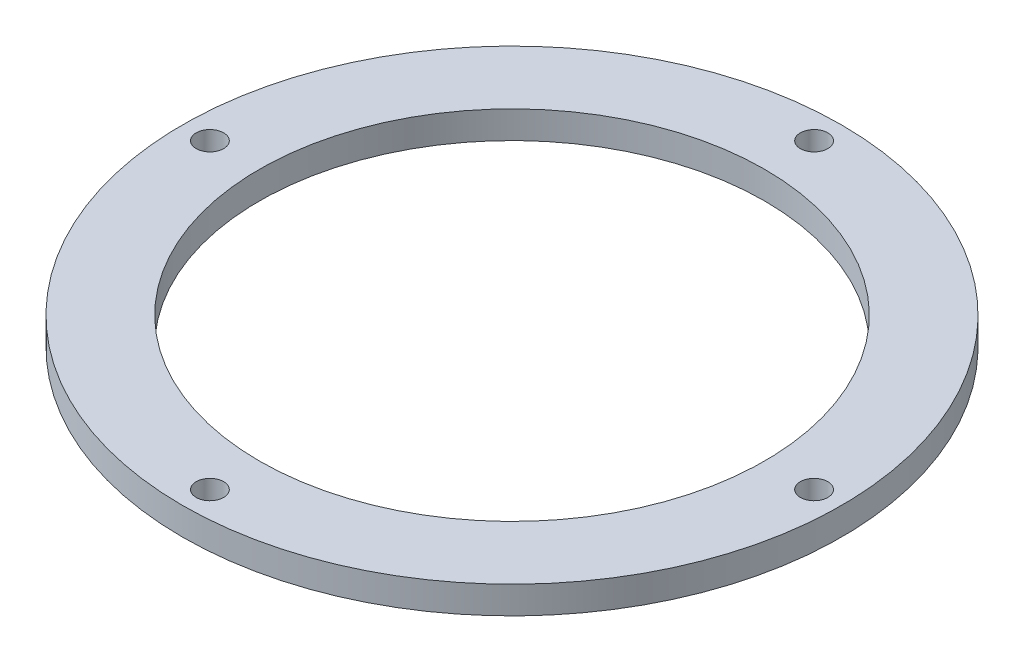
ISO-10303-21;
HEADER;
FILE_DESCRIPTION(('STEP AP214'),'2;1');
FILE_NAME('part.step','',(''),(''),'','','');
FILE_SCHEMA(('AUTOMOTIVE_DESIGN { 1 0 10303 214 1 1 1 1 }'));
ENDSEC;
DATA;
#1=APPLICATION_CONTEXT('core data for automotive mechanical design processes');
#2=APPLICATION_PROTOCOL_DEFINITION('international standard','automotive_design',2000,#1);
#3=PRODUCT_CONTEXT('',#1,'mechanical');
#4=PRODUCT('Part','Part','',(#3));
#5=PRODUCT_RELATED_PRODUCT_CATEGORY('part','',(#4));
#6=PRODUCT_DEFINITION_FORMATION('','',#4);
#7=PRODUCT_DEFINITION_CONTEXT('part definition',#1,'design');
#8=PRODUCT_DEFINITION('design','',#6,#7);
#9=PRODUCT_DEFINITION_SHAPE('','',#8);
#10=(LENGTH_UNIT() NAMED_UNIT(*) SI_UNIT(.MILLI.,.METRE.));
#11=(NAMED_UNIT(*) PLANE_ANGLE_UNIT() SI_UNIT($,.RADIAN.));
#12=(NAMED_UNIT(*) SI_UNIT($,.STERADIAN.) SOLID_ANGLE_UNIT());
#13=UNCERTAINTY_MEASURE_WITH_UNIT(LENGTH_MEASURE(1.E-05),#10,'distance_accuracy_value','');
#14=(GEOMETRIC_REPRESENTATION_CONTEXT(3) GLOBAL_UNCERTAINTY_ASSIGNED_CONTEXT((#13)) GLOBAL_UNIT_ASSIGNED_CONTEXT((#10,
#11,#12)) REPRESENTATION_CONTEXT('',''));
#15=CARTESIAN_POINT('',(0.,0.,0.));
#16=DIRECTION('',(0.,0.,1.));
#17=DIRECTION('',(1.,0.,0.));
#18=AXIS2_PLACEMENT_3D('',#15,#16,#17);
#19=CARTESIAN_POINT('',(0.,5.,0.));
#20=DIRECTION('',(0.,1.,0.));
#21=DIRECTION('',(0.,0.,1.));
#22=AXIS2_PLACEMENT_3D('',#19,#20,#21);
#23=PLANE('',#22);
#24=CARTESIAN_POINT('',(0.,5.,-55.));
#25=DIRECTION('',(0.,1.,0.));
#26=DIRECTION('',(0.,0.,1.));
#27=AXIS2_PLACEMENT_3D('',#24,#25,#26);
#28=CIRCLE('',#27,2.5);
#29=CARTESIAN_POINT('',(0.,5.,-52.5));
#30=VERTEX_POINT('',#29);
#31=EDGE_CURVE('E67',#30,#30,#28,.T.);
#32=ORIENTED_EDGE('',*,*,#31,.F.);
#33=EDGE_LOOP('',(#32));
#34=FACE_BOUND('',#33,.T.);
#35=CARTESIAN_POINT('',(55.0000000000016,5.,-1.55431223447522E-12));
#36=DIRECTION('',(0.,1.,0.));
#37=DIRECTION('',(0.,0.,1.));
#38=AXIS2_PLACEMENT_3D('',#35,#36,#37);
#39=CIRCLE('',#38,2.5);
#40=CARTESIAN_POINT('',(55.0000000000016,5.,2.49999999999845));
#41=VERTEX_POINT('',#40);
#42=EDGE_CURVE('E61',#41,#41,#39,.T.);
#43=ORIENTED_EDGE('',*,*,#42,.F.);
#44=EDGE_LOOP('',(#43));
#45=FACE_BOUND('',#44,.T.);
#46=CARTESIAN_POINT('',(3.11296127764038E-12,5.,55.));
#47=DIRECTION('',(0.,1.,0.));
#48=DIRECTION('',(0.,0.,1.));
#49=AXIS2_PLACEMENT_3D('',#46,#47,#48);
#50=CIRCLE('',#49,2.5);
#51=CARTESIAN_POINT('',(3.11296127764038E-12,5.,57.5));
#52=VERTEX_POINT('',#51);
#53=EDGE_CURVE('E55',#52,#52,#50,.T.);
#54=ORIENTED_EDGE('',*,*,#53,.F.);
#55=EDGE_LOOP('',(#54));
#56=FACE_BOUND('',#55,.T.);
#57=CARTESIAN_POINT('',(-54.9999999999984,5.,1.54737334057131E-12));
#58=DIRECTION('',(0.,1.,0.));
#59=DIRECTION('',(0.,0.,1.));
#60=AXIS2_PLACEMENT_3D('',#57,#58,#59);
#61=CIRCLE('',#60,2.5);
#62=CARTESIAN_POINT('',(-54.9999999999984,5.,2.50000000000155));
#63=VERTEX_POINT('',#62);
#64=EDGE_CURVE('E49',#63,#63,#61,.T.);
#65=ORIENTED_EDGE('',*,*,#64,.F.);
#66=EDGE_LOOP('',(#65));
#67=FACE_BOUND('',#66,.T.);
#68=CARTESIAN_POINT('',(0.,5.,0.));
#69=DIRECTION('',(0.,1.,0.));
#70=DIRECTION('',(0.,0.,1.));
#71=AXIS2_PLACEMENT_3D('',#68,#69,#70);
#72=CIRCLE('',#71,60.);
#73=CARTESIAN_POINT('',(0.,5.,60.));
#74=VERTEX_POINT('',#73);
#75=EDGE_CURVE('E10',#74,#74,#72,.T.);
#76=ORIENTED_EDGE('',*,*,#75,.T.);
#77=EDGE_LOOP('',(#76));
#78=FACE_BOUND('',#77,.T.);
#79=CARTESIAN_POINT('',(0.,5.,0.));
#80=DIRECTION('',(0.,1.,0.));
#81=DIRECTION('',(0.,0.,1.));
#82=AXIS2_PLACEMENT_3D('',#79,#80,#81);
#83=CIRCLE('',#82,46.);
#84=CARTESIAN_POINT('',(0.,5.,46.));
#85=VERTEX_POINT('',#84);
#86=EDGE_CURVE('E41',#85,#85,#83,.T.);
#87=ORIENTED_EDGE('',*,*,#86,.F.);
#88=EDGE_LOOP('',(#87));
#89=FACE_BOUND('',#88,.T.);
#90=ADVANCED_FACE('F30',(#34,#45,#56,#67,#78,#89),#23,.T.);
#91=CARTESIAN_POINT('',(0.,0.,0.));
#92=DIRECTION('',(0.,1.,0.));
#93=DIRECTION('',(0.,0.,1.));
#94=AXIS2_PLACEMENT_3D('',#91,#92,#93);
#95=PLANE('',#94);
#96=CARTESIAN_POINT('',(0.,0.,-55.));
#97=DIRECTION('',(0.,1.,0.));
#98=DIRECTION('',(0.,0.,1.));
#99=AXIS2_PLACEMENT_3D('',#96,#97,#98);
#100=CIRCLE('',#99,2.5);
#101=CARTESIAN_POINT('',(0.,0.,-52.5));
#102=VERTEX_POINT('',#101);
#103=EDGE_CURVE('E46',#102,#102,#100,.T.);
#104=ORIENTED_EDGE('',*,*,#103,.T.);
#105=EDGE_LOOP('',(#104));
#106=FACE_BOUND('',#105,.T.);
#107=CARTESIAN_POINT('',(55.0000000000016,0.,-1.55431223447522E-12));
#108=DIRECTION('',(0.,1.,0.));
#109=DIRECTION('',(0.,0.,1.));
#110=AXIS2_PLACEMENT_3D('',#107,#108,#109);
#111=CIRCLE('',#110,2.5);
#112=CARTESIAN_POINT('',(55.0000000000016,0.,2.49999999999845));
#113=VERTEX_POINT('',#112);
#114=EDGE_CURVE('E64',#113,#113,#111,.T.);
#115=ORIENTED_EDGE('',*,*,#114,.T.);
#116=EDGE_LOOP('',(#115));
#117=FACE_BOUND('',#116,.T.);
#118=CARTESIAN_POINT('',(3.11296127764038E-12,0.,55.));
#119=DIRECTION('',(0.,1.,0.));
#120=DIRECTION('',(0.,0.,1.));
#121=AXIS2_PLACEMENT_3D('',#118,#119,#120);
#122=CIRCLE('',#121,2.5);
#123=CARTESIAN_POINT('',(3.11296127764038E-12,0.,57.5));
#124=VERTEX_POINT('',#123);
#125=EDGE_CURVE('E58',#124,#124,#122,.T.);
#126=ORIENTED_EDGE('',*,*,#125,.T.);
#127=EDGE_LOOP('',(#126));
#128=FACE_BOUND('',#127,.T.);
#129=CARTESIAN_POINT('',(-54.9999999999984,0.,1.54737334057131E-12));
#130=DIRECTION('',(0.,1.,0.));
#131=DIRECTION('',(0.,0.,1.));
#132=AXIS2_PLACEMENT_3D('',#129,#130,#131);
#133=CIRCLE('',#132,2.5);
#134=CARTESIAN_POINT('',(-54.9999999999984,0.,2.50000000000155));
#135=VERTEX_POINT('',#134);
#136=EDGE_CURVE('E52',#135,#135,#133,.T.);
#137=ORIENTED_EDGE('',*,*,#136,.T.);
#138=EDGE_LOOP('',(#137));
#139=FACE_BOUND('',#138,.T.);
#140=CARTESIAN_POINT('',(0.,0.,0.));
#141=DIRECTION('',(0.,1.,0.));
#142=DIRECTION('',(0.,0.,1.));
#143=AXIS2_PLACEMENT_3D('',#140,#141,#142);
#144=CIRCLE('',#143,60.);
#145=CARTESIAN_POINT('',(0.,0.,60.));
#146=VERTEX_POINT('',#145);
#147=EDGE_CURVE('E34',#146,#146,#144,.T.);
#148=ORIENTED_EDGE('',*,*,#147,.F.);
#149=EDGE_LOOP('',(#148));
#150=FACE_BOUND('',#149,.T.);
#151=CARTESIAN_POINT('',(0.,0.,0.));
#152=DIRECTION('',(0.,1.,0.));
#153=DIRECTION('',(0.,0.,1.));
#154=AXIS2_PLACEMENT_3D('',#151,#152,#153);
#155=CIRCLE('',#154,46.);
#156=CARTESIAN_POINT('',(0.,0.,46.));
#157=VERTEX_POINT('',#156);
#158=EDGE_CURVE('E43',#157,#157,#155,.T.);
#159=ORIENTED_EDGE('',*,*,#158,.T.);
#160=EDGE_LOOP('',(#159));
#161=FACE_BOUND('',#160,.T.);
#162=ADVANCED_FACE('F73',(#106,#117,#128,#139,#150,#161),#95,.F.);
#163=CARTESIAN_POINT('',(0.,5.,0.));
#164=DIRECTION('',(0.,-1.,0.));
#165=DIRECTION('',(0.,0.,-1.));
#166=AXIS2_PLACEMENT_3D('',#163,#164,#165);
#167=CYLINDRICAL_SURFACE('',#166,60.);
#168=ORIENTED_EDGE('',*,*,#75,.F.);
#169=EDGE_LOOP('',(#168));
#170=FACE_BOUND('',#169,.T.);
#171=ORIENTED_EDGE('',*,*,#147,.T.);
#172=EDGE_LOOP('',(#171));
#173=FACE_BOUND('',#172,.T.);
#174=ADVANCED_FACE('F32',(#170,#173),#167,.T.);
#175=CARTESIAN_POINT('',(0.,5.,0.));
#176=DIRECTION('',(0.,-1.,0.));
#177=DIRECTION('',(0.,0.,-1.));
#178=AXIS2_PLACEMENT_3D('',#175,#176,#177);
#179=CYLINDRICAL_SURFACE('',#178,46.);
#180=ORIENTED_EDGE('',*,*,#86,.T.);
#181=EDGE_LOOP('',(#180));
#182=FACE_BOUND('',#181,.T.);
#183=ORIENTED_EDGE('',*,*,#158,.F.);
#184=EDGE_LOOP('',(#183));
#185=FACE_BOUND('',#184,.T.);
#186=ADVANCED_FACE('F94',(#182,#185),#179,.F.);
#187=CARTESIAN_POINT('',(-54.9999999999984,0.,1.54737334057131E-12));
#188=DIRECTION('',(0.,1.,0.));
#189=DIRECTION('',(0.,0.,1.));
#190=AXIS2_PLACEMENT_3D('',#187,#188,#189);
#191=CYLINDRICAL_SURFACE('',#190,2.5);
#192=ORIENTED_EDGE('',*,*,#136,.F.);
#193=EDGE_LOOP('',(#192));
#194=FACE_BOUND('',#193,.T.);
#195=ORIENTED_EDGE('',*,*,#64,.T.);
#196=EDGE_LOOP('',(#195));
#197=FACE_BOUND('',#196,.T.);
#198=ADVANCED_FACE('F97',(#194,#197),#191,.F.);
#199=CARTESIAN_POINT('',(3.11296127764038E-12,0.,55.));
#200=DIRECTION('',(0.,1.,0.));
#201=DIRECTION('',(0.,0.,1.));
#202=AXIS2_PLACEMENT_3D('',#199,#200,#201);
#203=CYLINDRICAL_SURFACE('',#202,2.5);
#204=ORIENTED_EDGE('',*,*,#125,.F.);
#205=EDGE_LOOP('',(#204));
#206=FACE_BOUND('',#205,.T.);
#207=ORIENTED_EDGE('',*,*,#53,.T.);
#208=EDGE_LOOP('',(#207));
#209=FACE_BOUND('',#208,.T.);
#210=ADVANCED_FACE('F109',(#206,#209),#203,.F.);
#211=CARTESIAN_POINT('',(55.0000000000016,0.,-1.55431223447522E-12));
#212=DIRECTION('',(0.,1.,0.));
#213=DIRECTION('',(0.,0.,1.));
#214=AXIS2_PLACEMENT_3D('',#211,#212,#213);
#215=CYLINDRICAL_SURFACE('',#214,2.5);
#216=ORIENTED_EDGE('',*,*,#114,.F.);
#217=EDGE_LOOP('',(#216));
#218=FACE_BOUND('',#217,.T.);
#219=ORIENTED_EDGE('',*,*,#42,.T.);
#220=EDGE_LOOP('',(#219));
#221=FACE_BOUND('',#220,.T.);
#222=ADVANCED_FACE('F79',(#218,#221),#215,.F.);
#223=CARTESIAN_POINT('',(0.,0.,-55.));
#224=DIRECTION('',(0.,1.,0.));
#225=DIRECTION('',(0.,0.,1.));
#226=AXIS2_PLACEMENT_3D('',#223,#224,#225);
#227=CYLINDRICAL_SURFACE('',#226,2.5);
#228=ORIENTED_EDGE('',*,*,#103,.F.);
#229=EDGE_LOOP('',(#228));
#230=FACE_BOUND('',#229,.T.);
#231=ORIENTED_EDGE('',*,*,#31,.T.);
#232=EDGE_LOOP('',(#231));
#233=FACE_BOUND('',#232,.T.);
#234=ADVANCED_FACE('F76',(#230,#233),#227,.F.);
#235=CLOSED_SHELL('',(#90,#162,#174,#186,#198,#210,#222,#234));
#236=MANIFOLD_SOLID_BREP('B2',#235);
#237=ADVANCED_BREP_SHAPE_REPRESENTATION('',(#18,#236),#14);
#238=SHAPE_DEFINITION_REPRESENTATION(#9,#237);
ENDSEC;
END-ISO-10303-21;
